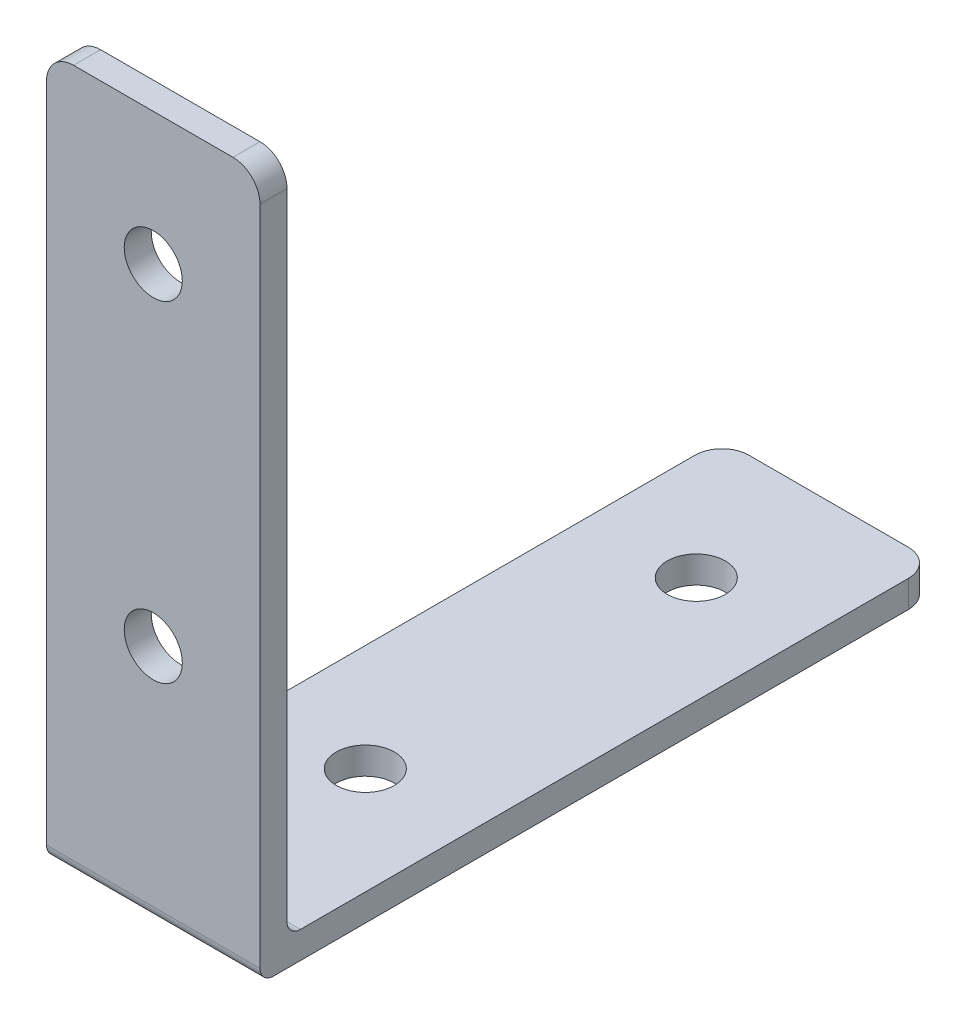
ISO-10303-21;
HEADER;
FILE_DESCRIPTION(('STEP AP214'),'2;1');
FILE_NAME('part.step','',(''),(''),'','','');
FILE_SCHEMA(('AUTOMOTIVE_DESIGN { 1 0 10303 214 1 1 1 1 }'));
ENDSEC;
DATA;
#1=APPLICATION_CONTEXT('core data for automotive mechanical design processes');
#2=APPLICATION_PROTOCOL_DEFINITION('international standard','automotive_design',2000,#1);
#3=PRODUCT_CONTEXT('',#1,'mechanical');
#4=PRODUCT('Part','Part','',(#3));
#5=PRODUCT_RELATED_PRODUCT_CATEGORY('part','',(#4));
#6=PRODUCT_DEFINITION_FORMATION('','',#4);
#7=PRODUCT_DEFINITION_CONTEXT('part definition',#1,'design');
#8=PRODUCT_DEFINITION('design','',#6,#7);
#9=PRODUCT_DEFINITION_SHAPE('','',#8);
#10=(LENGTH_UNIT() NAMED_UNIT(*) SI_UNIT(.MILLI.,.METRE.));
#11=(NAMED_UNIT(*) PLANE_ANGLE_UNIT() SI_UNIT($,.RADIAN.));
#12=(NAMED_UNIT(*) SI_UNIT($,.STERADIAN.) SOLID_ANGLE_UNIT());
#13=UNCERTAINTY_MEASURE_WITH_UNIT(LENGTH_MEASURE(1.E-05),#10,'distance_accuracy_value','');
#14=(GEOMETRIC_REPRESENTATION_CONTEXT(3) GLOBAL_UNCERTAINTY_ASSIGNED_CONTEXT((#13)) GLOBAL_UNIT_ASSIGNED_CONTEXT((#10,
#11,#12)) REPRESENTATION_CONTEXT('',''));
#15=CARTESIAN_POINT('',(0.,0.,0.));
#16=DIRECTION('',(0.,0.,1.));
#17=DIRECTION('',(1.,0.,0.));
#18=AXIS2_PLACEMENT_3D('',#15,#16,#17);
#19=CARTESIAN_POINT('',(0.,0.,49.));
#20=DIRECTION('',(-1.,0.,0.));
#21=DIRECTION('',(0.,-1.,0.));
#22=AXIS2_PLACEMENT_3D('',#19,#20,#21);
#23=CYLINDRICAL_SURFACE('',#22,1.);
#24=DIRECTION('',(1.,0.,0.));
#25=VECTOR('',#24,1.);
#26=CARTESIAN_POINT('',(0.,0.,50.));
#27=LINE('',#26,#25);
#28=CARTESIAN_POINT('',(-7.9,0.,50.));
#29=VERTEX_POINT('',#28);
#30=CARTESIAN_POINT('',(7.9,0.,50.));
#31=VERTEX_POINT('',#30);
#32=EDGE_CURVE('E129',#29,#31,#27,.T.);
#33=ORIENTED_EDGE('',*,*,#32,.F.);
#34=CARTESIAN_POINT('',(-7.9,0.,49.));
#35=DIRECTION('',(1.,0.,0.));
#36=DIRECTION('',(0.,0.,-1.));
#37=AXIS2_PLACEMENT_3D('',#34,#35,#36);
#38=CIRCLE('',#37,1.);
#39=CARTESIAN_POINT('',(-7.9,-1.,49.));
#40=VERTEX_POINT('',#39);
#41=EDGE_CURVE('E136',#40,#29,#38,.F.);
#42=ORIENTED_EDGE('',*,*,#41,.F.);
#43=DIRECTION('',(1.,0.,0.));
#44=VECTOR('',#43,1.);
#45=CARTESIAN_POINT('',(0.,-1.,49.));
#46=LINE('',#45,#44);
#47=CARTESIAN_POINT('',(7.9,-0.999999999999999,49.));
#48=VERTEX_POINT('',#47);
#49=EDGE_CURVE('E146',#48,#40,#46,.F.);
#50=ORIENTED_EDGE('',*,*,#49,.F.);
#51=CARTESIAN_POINT('',(7.9,0.,49.));
#52=DIRECTION('',(-1.,0.,0.));
#53=DIRECTION('',(0.,0.,1.));
#54=AXIS2_PLACEMENT_3D('',#51,#52,#53);
#55=CIRCLE('',#54,1.);
#56=EDGE_CURVE('E145',#31,#48,#55,.F.);
#57=ORIENTED_EDGE('',*,*,#56,.F.);
#58=EDGE_LOOP('',(#33,#42,#50,#57));
#59=FACE_BOUND('',#58,.T.);
#60=ADVANCED_FACE('F32',(#59),#23,.T.);
#61=CARTESIAN_POINT('',(7.9,1.,50.));
#62=DIRECTION('',(0.,-1.,0.));
#63=DIRECTION('',(1.,0.,0.));
#64=AXIS2_PLACEMENT_3D('',#61,#62,#63);
#65=PLANE('',#64);
#66=CARTESIAN_POINT('',(0.,1.,9.8));
#67=DIRECTION('',(0.,1.,0.));
#68=DIRECTION('',(-1.,0.,0.));
#69=AXIS2_PLACEMENT_3D('',#66,#67,#68);
#70=CIRCLE('',#69,2.15);
#71=CARTESIAN_POINT('',(-2.15,1.,9.8));
#72=VERTEX_POINT('',#71);
#73=EDGE_CURVE('E198',#72,#72,#70,.T.);
#74=ORIENTED_EDGE('',*,*,#73,.F.);
#75=EDGE_LOOP('',(#74));
#76=FACE_BOUND('',#75,.T.);
#77=CARTESIAN_POINT('',(0.,1.,34.3));
#78=DIRECTION('',(0.,1.,0.));
#79=DIRECTION('',(-1.,0.,0.));
#80=AXIS2_PLACEMENT_3D('',#77,#78,#79);
#81=CIRCLE('',#80,2.15);
#82=CARTESIAN_POINT('',(-2.15,1.,34.3));
#83=VERTEX_POINT('',#82);
#84=EDGE_CURVE('E204',#83,#83,#81,.T.);
#85=ORIENTED_EDGE('',*,*,#84,.F.);
#86=EDGE_LOOP('',(#85));
#87=FACE_BOUND('',#86,.T.);
#88=DIRECTION('',(0.,0.,-1.));
#89=VECTOR('',#88,1.);
#90=CARTESIAN_POINT('',(7.9,1.,50.));
#91=LINE('',#90,#89);
#92=CARTESIAN_POINT('',(7.9,1.,47.));
#93=VERTEX_POINT('',#92);
#94=CARTESIAN_POINT('',(7.9,1.,2.));
#95=VERTEX_POINT('',#94);
#96=EDGE_CURVE('E238',#93,#95,#91,.T.);
#97=ORIENTED_EDGE('',*,*,#96,.T.);
#98=CARTESIAN_POINT('',(5.9,1.,2.));
#99=DIRECTION('',(0.,-1.,0.));
#100=DIRECTION('',(1.,0.,0.));
#101=AXIS2_PLACEMENT_3D('',#98,#99,#100);
#102=CIRCLE('',#101,2.);
#103=CARTESIAN_POINT('',(5.9,1.,0.));
#104=VERTEX_POINT('',#103);
#105=EDGE_CURVE('E180',#95,#104,#102,.F.);
#106=ORIENTED_EDGE('',*,*,#105,.T.);
#107=DIRECTION('',(-1.,0.,0.));
#108=VECTOR('',#107,1.);
#109=CARTESIAN_POINT('',(7.9,1.,0.));
#110=LINE('',#109,#108);
#111=CARTESIAN_POINT('',(-5.9,1.,0.));
#112=VERTEX_POINT('',#111);
#113=EDGE_CURVE('E133',#104,#112,#110,.T.);
#114=ORIENTED_EDGE('',*,*,#113,.T.);
#115=CARTESIAN_POINT('',(-5.9,1.,2.));
#116=DIRECTION('',(0.,-1.,0.));
#117=DIRECTION('',(1.,0.,0.));
#118=AXIS2_PLACEMENT_3D('',#115,#116,#117);
#119=CIRCLE('',#118,2.);
#120=CARTESIAN_POINT('',(-7.9,1.,2.));
#121=VERTEX_POINT('',#120);
#122=EDGE_CURVE('E178',#112,#121,#119,.F.);
#123=ORIENTED_EDGE('',*,*,#122,.T.);
#124=DIRECTION('',(0.,0.,-1.));
#125=VECTOR('',#124,1.);
#126=CARTESIAN_POINT('',(-7.9,1.,50.));
#127=LINE('',#126,#125);
#128=CARTESIAN_POINT('',(-7.9,1.,47.));
#129=VERTEX_POINT('',#128);
#130=EDGE_CURVE('E232',#129,#121,#127,.T.);
#131=ORIENTED_EDGE('',*,*,#130,.F.);
#132=DIRECTION('',(-1.,0.,0.));
#133=VECTOR('',#132,1.);
#134=CARTESIAN_POINT('',(7.9,1.,47.));
#135=LINE('',#134,#133);
#136=EDGE_CURVE('E158',#129,#93,#135,.F.);
#137=ORIENTED_EDGE('',*,*,#136,.T.);
#138=EDGE_LOOP('',(#97,#106,#114,#123,#131,#137));
#139=FACE_BOUND('',#138,.T.);
#140=ADVANCED_FACE('F253',(#76,#87,#139),#65,.F.);
#141=CARTESIAN_POINT('',(-7.9,-1.,50.));
#142=DIRECTION('',(1.,0.,0.));
#143=DIRECTION('',(0.,0.,-1.));
#144=AXIS2_PLACEMENT_3D('',#141,#142,#143);
#145=PLANE('',#144);
#146=ORIENTED_EDGE('',*,*,#130,.T.);
#147=DIRECTION('',(0.,-1.,0.));
#148=VECTOR('',#147,1.);
#149=CARTESIAN_POINT('',(-7.9,-1.,2.));
#150=LINE('',#149,#148);
#151=CARTESIAN_POINT('',(-7.9,-1.,2.));
#152=VERTEX_POINT('',#151);
#153=EDGE_CURVE('E192',#121,#152,#150,.T.);
#154=ORIENTED_EDGE('',*,*,#153,.T.);
#155=DIRECTION('',(0.,0.,-1.));
#156=VECTOR('',#155,1.);
#157=CARTESIAN_POINT('',(-7.9,-1.,50.));
#158=LINE('',#157,#156);
#159=EDGE_CURVE('E141',#40,#152,#158,.T.);
#160=ORIENTED_EDGE('',*,*,#159,.F.);
#161=ORIENTED_EDGE('',*,*,#41,.T.);
#162=DIRECTION('',(0.,-1.,0.));
#163=VECTOR('',#162,1.);
#164=CARTESIAN_POINT('',(-7.9,-1.,50.));
#165=LINE('',#164,#163);
#166=CARTESIAN_POINT('',(-7.9,49.,50.));
#167=VERTEX_POINT('',#166);
#168=EDGE_CURVE('E123',#167,#29,#165,.T.);
#169=ORIENTED_EDGE('',*,*,#168,.F.);
#170=DIRECTION('',(0.,0.,1.));
#171=VECTOR('',#170,1.);
#172=CARTESIAN_POINT('',(-7.9,49.,50.));
#173=LINE('',#172,#171);
#174=CARTESIAN_POINT('',(-7.90000000000001,49.,48.));
#175=VERTEX_POINT('',#174);
#176=EDGE_CURVE('E190',#167,#175,#173,.F.);
#177=ORIENTED_EDGE('',*,*,#176,.T.);
#178=DIRECTION('',(0.,-1.,0.));
#179=VECTOR('',#178,1.);
#180=CARTESIAN_POINT('',(-7.90000000000001,51.,48.));
#181=LINE('',#180,#179);
#182=CARTESIAN_POINT('',(-7.9,2.,48.));
#183=VERTEX_POINT('',#182);
#184=EDGE_CURVE('E226',#175,#183,#181,.T.);
#185=ORIENTED_EDGE('',*,*,#184,.T.);
#186=CARTESIAN_POINT('',(-7.9,2.,47.));
#187=DIRECTION('',(1.,0.,0.));
#188=DIRECTION('',(0.,0.,-1.));
#189=AXIS2_PLACEMENT_3D('',#186,#187,#188);
#190=CIRCLE('',#189,1.);
#191=EDGE_CURVE('E160',#183,#129,#190,.T.);
#192=ORIENTED_EDGE('',*,*,#191,.T.);
#193=EDGE_LOOP('',(#146,#154,#160,#161,#169,#177,#185,#192));
#194=FACE_BOUND('',#193,.T.);
#195=ADVANCED_FACE('F138',(#194),#145,.F.);
#196=CARTESIAN_POINT('',(7.9,-0.999999999999999,50.));
#197=DIRECTION('',(0.,1.,0.));
#198=DIRECTION('',(-1.,0.,0.));
#199=AXIS2_PLACEMENT_3D('',#196,#197,#198);
#200=PLANE('',#199);
#201=CARTESIAN_POINT('',(0.,-1.,9.8));
#202=DIRECTION('',(0.,1.,0.));
#203=DIRECTION('',(-1.,0.,0.));
#204=AXIS2_PLACEMENT_3D('',#201,#202,#203);
#205=CIRCLE('',#204,2.15);
#206=CARTESIAN_POINT('',(-2.15,-1.,9.8));
#207=VERTEX_POINT('',#206);
#208=EDGE_CURVE('E36',#207,#207,#205,.T.);
#209=ORIENTED_EDGE('',*,*,#208,.T.);
#210=EDGE_LOOP('',(#209));
#211=FACE_BOUND('',#210,.T.);
#212=CARTESIAN_POINT('',(0.,-1.,34.3));
#213=DIRECTION('',(0.,1.,0.));
#214=DIRECTION('',(-1.,0.,0.));
#215=AXIS2_PLACEMENT_3D('',#212,#213,#214);
#216=CIRCLE('',#215,2.15);
#217=CARTESIAN_POINT('',(-2.15,-1.,34.3));
#218=VERTEX_POINT('',#217);
#219=EDGE_CURVE('E196',#218,#218,#216,.T.);
#220=ORIENTED_EDGE('',*,*,#219,.T.);
#221=EDGE_LOOP('',(#220));
#222=FACE_BOUND('',#221,.T.);
#223=DIRECTION('',(1.,0.,0.));
#224=VECTOR('',#223,1.);
#225=CARTESIAN_POINT('',(7.9,-0.999999999999999,0.));
#226=LINE('',#225,#224);
#227=CARTESIAN_POINT('',(-5.9,-1.,0.));
#228=VERTEX_POINT('',#227);
#229=CARTESIAN_POINT('',(5.9,-0.999999999999999,0.));
#230=VERTEX_POINT('',#229);
#231=EDGE_CURVE('E229',#228,#230,#226,.T.);
#232=ORIENTED_EDGE('',*,*,#231,.T.);
#233=CARTESIAN_POINT('',(5.9,-0.999999999999999,2.));
#234=DIRECTION('',(0.,1.,0.));
#235=DIRECTION('',(-1.,0.,0.));
#236=AXIS2_PLACEMENT_3D('',#233,#234,#235);
#237=CIRCLE('',#236,2.);
#238=CARTESIAN_POINT('',(7.9,-0.999999999999999,2.));
#239=VERTEX_POINT('',#238);
#240=EDGE_CURVE('E188',#230,#239,#237,.F.);
#241=ORIENTED_EDGE('',*,*,#240,.T.);
#242=DIRECTION('',(0.,0.,-1.));
#243=VECTOR('',#242,1.);
#244=CARTESIAN_POINT('',(7.9,-0.999999999999999,50.));
#245=LINE('',#244,#243);
#246=EDGE_CURVE('E150',#48,#239,#245,.T.);
#247=ORIENTED_EDGE('',*,*,#246,.F.);
#248=ORIENTED_EDGE('',*,*,#49,.T.);
#249=ORIENTED_EDGE('',*,*,#159,.T.);
#250=CARTESIAN_POINT('',(-5.9,-1.,2.));
#251=DIRECTION('',(0.,1.,0.));
#252=DIRECTION('',(-1.,0.,0.));
#253=AXIS2_PLACEMENT_3D('',#250,#251,#252);
#254=CIRCLE('',#253,2.);
#255=EDGE_CURVE('E186',#152,#228,#254,.F.);
#256=ORIENTED_EDGE('',*,*,#255,.T.);
#257=EDGE_LOOP('',(#232,#241,#247,#248,#249,#256));
#258=FACE_BOUND('',#257,.T.);
#259=ADVANCED_FACE('F371',(#211,#222,#258),#200,.F.);
#260=CARTESIAN_POINT('',(7.9,-0.999999999999999,50.));
#261=DIRECTION('',(-1.,0.,0.));
#262=DIRECTION('',(0.,0.,1.));
#263=AXIS2_PLACEMENT_3D('',#260,#261,#262);
#264=PLANE('',#263);
#265=ORIENTED_EDGE('',*,*,#246,.T.);
#266=DIRECTION('',(0.,1.,0.));
#267=VECTOR('',#266,1.);
#268=CARTESIAN_POINT('',(7.9,-0.999999999999999,2.));
#269=LINE('',#268,#267);
#270=EDGE_CURVE('E175',#239,#95,#269,.T.);
#271=ORIENTED_EDGE('',*,*,#270,.T.);
#272=ORIENTED_EDGE('',*,*,#96,.F.);
#273=CARTESIAN_POINT('',(7.9,2.,47.));
#274=DIRECTION('',(-1.,0.,0.));
#275=DIRECTION('',(0.,0.,1.));
#276=AXIS2_PLACEMENT_3D('',#273,#274,#275);
#277=CIRCLE('',#276,1.);
#278=CARTESIAN_POINT('',(7.9,2.,48.));
#279=VERTEX_POINT('',#278);
#280=EDGE_CURVE('E162',#93,#279,#277,.T.);
#281=ORIENTED_EDGE('',*,*,#280,.T.);
#282=DIRECTION('',(0.,-1.,0.));
#283=VECTOR('',#282,1.);
#284=CARTESIAN_POINT('',(7.89999999999999,51.,48.));
#285=LINE('',#284,#283);
#286=CARTESIAN_POINT('',(7.89999999999999,49.,48.));
#287=VERTEX_POINT('',#286);
#288=EDGE_CURVE('E228',#287,#279,#285,.T.);
#289=ORIENTED_EDGE('',*,*,#288,.F.);
#290=DIRECTION('',(0.,0.,-1.));
#291=VECTOR('',#290,1.);
#292=CARTESIAN_POINT('',(7.9,49.,50.));
#293=LINE('',#292,#291);
#294=CARTESIAN_POINT('',(7.9,49.,50.));
#295=VERTEX_POINT('',#294);
#296=EDGE_CURVE('E170',#287,#295,#293,.F.);
#297=ORIENTED_EDGE('',*,*,#296,.T.);
#298=DIRECTION('',(0.,1.,0.));
#299=VECTOR('',#298,1.);
#300=CARTESIAN_POINT('',(7.9,-0.999999999999999,50.));
#301=LINE('',#300,#299);
#302=EDGE_CURVE('E132',#31,#295,#301,.T.);
#303=ORIENTED_EDGE('',*,*,#302,.F.);
#304=ORIENTED_EDGE('',*,*,#56,.T.);
#305=EDGE_LOOP('',(#265,#271,#272,#281,#289,#297,#303,#304));
#306=FACE_BOUND('',#305,.T.);
#307=ADVANCED_FACE('F244',(#306),#264,.F.);
#308=CARTESIAN_POINT('',(0.,0.,50.));
#309=DIRECTION('',(0.,0.,1.));
#310=DIRECTION('',(1.,0.,0.));
#311=AXIS2_PLACEMENT_3D('',#308,#309,#310);
#312=PLANE('',#311);
#313=CARTESIAN_POINT('',(0.,41.2,50.));
#314=DIRECTION('',(0.,0.,1.));
#315=DIRECTION('',(1.,0.,0.));
#316=AXIS2_PLACEMENT_3D('',#313,#314,#315);
#317=CIRCLE('',#316,2.15);
#318=CARTESIAN_POINT('',(2.15,41.2,50.));
#319=VERTEX_POINT('',#318);
#320=EDGE_CURVE('E219',#319,#319,#317,.T.);
#321=ORIENTED_EDGE('',*,*,#320,.F.);
#322=EDGE_LOOP('',(#321));
#323=FACE_BOUND('',#322,.T.);
#324=CARTESIAN_POINT('',(0.,16.7,50.));
#325=DIRECTION('',(0.,0.,1.));
#326=DIRECTION('',(1.,0.,0.));
#327=AXIS2_PLACEMENT_3D('',#324,#325,#326);
#328=CIRCLE('',#327,2.15);
#329=CARTESIAN_POINT('',(2.15,16.7,50.));
#330=VERTEX_POINT('',#329);
#331=EDGE_CURVE('E214',#330,#330,#328,.T.);
#332=ORIENTED_EDGE('',*,*,#331,.F.);
#333=EDGE_LOOP('',(#332));
#334=FACE_BOUND('',#333,.T.);
#335=DIRECTION('',(1.,0.,0.));
#336=VECTOR('',#335,1.);
#337=CARTESIAN_POINT('',(-7.90000000000001,51.,50.));
#338=LINE('',#337,#336);
#339=CARTESIAN_POINT('',(-5.9,51.,50.));
#340=VERTEX_POINT('',#339);
#341=CARTESIAN_POINT('',(5.9,51.,50.));
#342=VERTEX_POINT('',#341);
#343=EDGE_CURVE('E222',#340,#342,#338,.T.);
#344=ORIENTED_EDGE('',*,*,#343,.F.);
#345=CARTESIAN_POINT('',(-5.9,49.,50.));
#346=DIRECTION('',(0.,0.,1.));
#347=DIRECTION('',(1.,0.,0.));
#348=AXIS2_PLACEMENT_3D('',#345,#346,#347);
#349=CIRCLE('',#348,2.);
#350=EDGE_CURVE('E41',#340,#167,#349,.T.);
#351=ORIENTED_EDGE('',*,*,#350,.T.);
#352=ORIENTED_EDGE('',*,*,#168,.T.);
#353=ORIENTED_EDGE('',*,*,#32,.T.);
#354=ORIENTED_EDGE('',*,*,#302,.T.);
#355=CARTESIAN_POINT('',(5.9,49.,50.));
#356=DIRECTION('',(0.,0.,1.));
#357=DIRECTION('',(1.,0.,0.));
#358=AXIS2_PLACEMENT_3D('',#355,#356,#357);
#359=CIRCLE('',#358,2.);
#360=EDGE_CURVE('E172',#295,#342,#359,.T.);
#361=ORIENTED_EDGE('',*,*,#360,.T.);
#362=EDGE_LOOP('',(#344,#351,#352,#353,#354,#361));
#363=FACE_BOUND('',#362,.T.);
#364=ADVANCED_FACE('F126',(#323,#334,#363),#312,.T.);
#365=CARTESIAN_POINT('',(0.,0.,0.));
#366=DIRECTION('',(0.,0.,1.));
#367=DIRECTION('',(1.,0.,0.));
#368=AXIS2_PLACEMENT_3D('',#365,#366,#367);
#369=PLANE('',#368);
#370=ORIENTED_EDGE('',*,*,#113,.F.);
#371=DIRECTION('',(0.,1.,0.));
#372=VECTOR('',#371,1.);
#373=CARTESIAN_POINT('',(5.9,0.,0.));
#374=LINE('',#373,#372);
#375=EDGE_CURVE('E184',#104,#230,#374,.F.);
#376=ORIENTED_EDGE('',*,*,#375,.T.);
#377=ORIENTED_EDGE('',*,*,#231,.F.);
#378=DIRECTION('',(0.,-1.,0.));
#379=VECTOR('',#378,1.);
#380=CARTESIAN_POINT('',(-5.9,0.,0.));
#381=LINE('',#380,#379);
#382=EDGE_CURVE('E182',#228,#112,#381,.F.);
#383=ORIENTED_EDGE('',*,*,#382,.T.);
#384=EDGE_LOOP('',(#370,#376,#377,#383));
#385=FACE_BOUND('',#384,.T.);
#386=ADVANCED_FACE('F256',(#385),#369,.F.);
#387=CARTESIAN_POINT('',(-7.90000000000001,51.,48.));
#388=DIRECTION('',(0.,0.,1.));
#389=DIRECTION('',(1.,0.,0.));
#390=AXIS2_PLACEMENT_3D('',#387,#388,#389);
#391=PLANE('',#390);
#392=CARTESIAN_POINT('',(0.,41.2,48.));
#393=DIRECTION('',(0.,0.,-1.));
#394=DIRECTION('',(-1.,0.,0.));
#395=AXIS2_PLACEMENT_3D('',#392,#393,#394);
#396=CIRCLE('',#395,2.15);
#397=CARTESIAN_POINT('',(-2.15,41.2,48.));
#398=VERTEX_POINT('',#397);
#399=EDGE_CURVE('E211',#398,#398,#396,.T.);
#400=ORIENTED_EDGE('',*,*,#399,.F.);
#401=EDGE_LOOP('',(#400));
#402=FACE_BOUND('',#401,.T.);
#403=CARTESIAN_POINT('',(0.,16.7,48.));
#404=DIRECTION('',(0.,0.,-1.));
#405=DIRECTION('',(-1.,0.,0.));
#406=AXIS2_PLACEMENT_3D('',#403,#404,#405);
#407=CIRCLE('',#406,2.15);
#408=CARTESIAN_POINT('',(-2.15,16.7,48.));
#409=VERTEX_POINT('',#408);
#410=EDGE_CURVE('E202',#409,#409,#407,.T.);
#411=ORIENTED_EDGE('',*,*,#410,.F.);
#412=EDGE_LOOP('',(#411));
#413=FACE_BOUND('',#412,.T.);
#414=ORIENTED_EDGE('',*,*,#184,.F.);
#415=CARTESIAN_POINT('',(-5.9,49.,48.));
#416=DIRECTION('',(0.,0.,1.));
#417=DIRECTION('',(1.,0.,0.));
#418=AXIS2_PLACEMENT_3D('',#415,#416,#417);
#419=CIRCLE('',#418,2.);
#420=CARTESIAN_POINT('',(-5.9,51.,48.));
#421=VERTEX_POINT('',#420);
#422=EDGE_CURVE('E11',#175,#421,#419,.F.);
#423=ORIENTED_EDGE('',*,*,#422,.T.);
#424=DIRECTION('',(-1.,0.,0.));
#425=VECTOR('',#424,1.);
#426=CARTESIAN_POINT('',(-7.90000000000001,51.,48.));
#427=LINE('',#426,#425);
#428=CARTESIAN_POINT('',(5.9,51.,48.));
#429=VERTEX_POINT('',#428);
#430=EDGE_CURVE('E224',#429,#421,#427,.T.);
#431=ORIENTED_EDGE('',*,*,#430,.F.);
#432=CARTESIAN_POINT('',(5.9,49.,48.));
#433=DIRECTION('',(0.,0.,1.));
#434=DIRECTION('',(1.,0.,0.));
#435=AXIS2_PLACEMENT_3D('',#432,#433,#434);
#436=CIRCLE('',#435,2.);
#437=EDGE_CURVE('E168',#429,#287,#436,.F.);
#438=ORIENTED_EDGE('',*,*,#437,.T.);
#439=ORIENTED_EDGE('',*,*,#288,.T.);
#440=DIRECTION('',(-1.,0.,0.));
#441=VECTOR('',#440,1.);
#442=CARTESIAN_POINT('',(-7.9,2.,48.));
#443=LINE('',#442,#441);
#444=EDGE_CURVE('E155',#279,#183,#443,.T.);
#445=ORIENTED_EDGE('',*,*,#444,.T.);
#446=EDGE_LOOP('',(#414,#423,#431,#438,#439,#445));
#447=FACE_BOUND('',#446,.T.);
#448=ADVANCED_FACE('F269',(#402,#413,#447),#391,.F.);
#449=CARTESIAN_POINT('',(0.,51.,0.));
#450=DIRECTION('',(0.,-1.,0.));
#451=DIRECTION('',(1.,0.,0.));
#452=AXIS2_PLACEMENT_3D('',#449,#450,#451);
#453=PLANE('',#452);
#454=ORIENTED_EDGE('',*,*,#430,.T.);
#455=DIRECTION('',(0.,0.,1.));
#456=VECTOR('',#455,1.);
#457=CARTESIAN_POINT('',(-5.9,51.,0.));
#458=LINE('',#457,#456);
#459=EDGE_CURVE('E194',#421,#340,#458,.T.);
#460=ORIENTED_EDGE('',*,*,#459,.T.);
#461=ORIENTED_EDGE('',*,*,#343,.T.);
#462=DIRECTION('',(0.,0.,-1.));
#463=VECTOR('',#462,1.);
#464=CARTESIAN_POINT('',(5.9,51.,0.));
#465=LINE('',#464,#463);
#466=EDGE_CURVE('E165',#342,#429,#465,.T.);
#467=ORIENTED_EDGE('',*,*,#466,.T.);
#468=EDGE_LOOP('',(#454,#460,#461,#467));
#469=FACE_BOUND('',#468,.T.);
#470=ADVANCED_FACE('F277',(#469),#453,.F.);
#471=CARTESIAN_POINT('',(-7.9,2.,47.));
#472=DIRECTION('',(1.,0.,0.));
#473=DIRECTION('',(0.,1.,0.));
#474=AXIS2_PLACEMENT_3D('',#471,#472,#473);
#475=CYLINDRICAL_SURFACE('',#474,1.);
#476=ORIENTED_EDGE('',*,*,#280,.F.);
#477=ORIENTED_EDGE('',*,*,#136,.F.);
#478=ORIENTED_EDGE('',*,*,#191,.F.);
#479=ORIENTED_EDGE('',*,*,#444,.F.);
#480=EDGE_LOOP('',(#476,#477,#478,#479));
#481=FACE_BOUND('',#480,.T.);
#482=ADVANCED_FACE('F268',(#481),#475,.F.);
#483=CARTESIAN_POINT('',(5.9,49.,0.));
#484=DIRECTION('',(0.,0.,-1.));
#485=DIRECTION('',(-1.,0.,0.));
#486=AXIS2_PLACEMENT_3D('',#483,#484,#485);
#487=CYLINDRICAL_SURFACE('',#486,2.);
#488=ORIENTED_EDGE('',*,*,#360,.F.);
#489=ORIENTED_EDGE('',*,*,#296,.F.);
#490=ORIENTED_EDGE('',*,*,#437,.F.);
#491=ORIENTED_EDGE('',*,*,#466,.F.);
#492=EDGE_LOOP('',(#488,#489,#490,#491));
#493=FACE_BOUND('',#492,.T.);
#494=ADVANCED_FACE('F274',(#493),#487,.T.);
#495=CARTESIAN_POINT('',(5.9,-0.999999999999999,2.));
#496=DIRECTION('',(0.,1.,0.));
#497=DIRECTION('',(0.,0.,1.));
#498=AXIS2_PLACEMENT_3D('',#495,#496,#497);
#499=CYLINDRICAL_SURFACE('',#498,2.);
#500=ORIENTED_EDGE('',*,*,#240,.F.);
#501=ORIENTED_EDGE('',*,*,#375,.F.);
#502=ORIENTED_EDGE('',*,*,#105,.F.);
#503=ORIENTED_EDGE('',*,*,#270,.F.);
#504=EDGE_LOOP('',(#500,#501,#502,#503));
#505=FACE_BOUND('',#504,.T.);
#506=ADVANCED_FACE('F249',(#505),#499,.T.);
#507=CARTESIAN_POINT('',(-5.9,-1.,2.));
#508=DIRECTION('',(0.,-1.,0.));
#509=DIRECTION('',(0.,0.,-1.));
#510=AXIS2_PLACEMENT_3D('',#507,#508,#509);
#511=CYLINDRICAL_SURFACE('',#510,2.);
#512=ORIENTED_EDGE('',*,*,#122,.F.);
#513=ORIENTED_EDGE('',*,*,#382,.F.);
#514=ORIENTED_EDGE('',*,*,#255,.F.);
#515=ORIENTED_EDGE('',*,*,#153,.F.);
#516=EDGE_LOOP('',(#512,#513,#514,#515));
#517=FACE_BOUND('',#516,.T.);
#518=ADVANCED_FACE('F260',(#517),#511,.T.);
#519=CARTESIAN_POINT('',(-5.9,49.,0.));
#520=DIRECTION('',(0.,0.,1.));
#521=DIRECTION('',(1.,0.,0.));
#522=AXIS2_PLACEMENT_3D('',#519,#520,#521);
#523=CYLINDRICAL_SURFACE('',#522,2.);
#524=ORIENTED_EDGE('',*,*,#422,.F.);
#525=ORIENTED_EDGE('',*,*,#176,.F.);
#526=ORIENTED_EDGE('',*,*,#350,.F.);
#527=ORIENTED_EDGE('',*,*,#459,.F.);
#528=EDGE_LOOP('',(#524,#525,#526,#527));
#529=FACE_BOUND('',#528,.T.);
#530=ADVANCED_FACE('F34',(#529),#523,.T.);
#531=CARTESIAN_POINT('',(0.,16.7,98.));
#532=DIRECTION('',(0.,0.,-1.));
#533=DIRECTION('',(-1.,0.,0.));
#534=AXIS2_PLACEMENT_3D('',#531,#532,#533);
#535=CYLINDRICAL_SURFACE('',#534,2.15);
#536=ORIENTED_EDGE('',*,*,#331,.T.);
#537=EDGE_LOOP('',(#536));
#538=FACE_BOUND('',#537,.T.);
#539=ORIENTED_EDGE('',*,*,#410,.T.);
#540=EDGE_LOOP('',(#539));
#541=FACE_BOUND('',#540,.T.);
#542=ADVANCED_FACE('F279',(#538,#541),#535,.F.);
#543=CARTESIAN_POINT('',(0.,41.2,98.));
#544=DIRECTION('',(0.,0.,-1.));
#545=DIRECTION('',(-1.,0.,0.));
#546=AXIS2_PLACEMENT_3D('',#543,#544,#545);
#547=CYLINDRICAL_SURFACE('',#546,2.15);
#548=ORIENTED_EDGE('',*,*,#320,.T.);
#549=EDGE_LOOP('',(#548));
#550=FACE_BOUND('',#549,.T.);
#551=ORIENTED_EDGE('',*,*,#399,.T.);
#552=EDGE_LOOP('',(#551));
#553=FACE_BOUND('',#552,.T.);
#554=ADVANCED_FACE('F284',(#550,#553),#547,.F.);
#555=CARTESIAN_POINT('',(0.,-49.,34.3));
#556=DIRECTION('',(0.,1.,0.));
#557=DIRECTION('',(-1.,0.,0.));
#558=AXIS2_PLACEMENT_3D('',#555,#556,#557);
#559=CYLINDRICAL_SURFACE('',#558,2.15);
#560=ORIENTED_EDGE('',*,*,#84,.T.);
#561=EDGE_LOOP('',(#560));
#562=FACE_BOUND('',#561,.T.);
#563=ORIENTED_EDGE('',*,*,#219,.F.);
#564=EDGE_LOOP('',(#563));
#565=FACE_BOUND('',#564,.T.);
#566=ADVANCED_FACE('F354',(#562,#565),#559,.F.);
#567=CARTESIAN_POINT('',(0.,-49.,9.8));
#568=DIRECTION('',(0.,1.,0.));
#569=DIRECTION('',(-1.,0.,0.));
#570=AXIS2_PLACEMENT_3D('',#567,#568,#569);
#571=CYLINDRICAL_SURFACE('',#570,2.15);
#572=ORIENTED_EDGE('',*,*,#73,.T.);
#573=EDGE_LOOP('',(#572));
#574=FACE_BOUND('',#573,.T.);
#575=ORIENTED_EDGE('',*,*,#208,.F.);
#576=EDGE_LOOP('',(#575));
#577=FACE_BOUND('',#576,.T.);
#578=ADVANCED_FACE('F384',(#574,#577),#571,.F.);
#579=CLOSED_SHELL('',(#60,#140,#195,#259,#307,#364,#386,#448,#470,#482,#494,#506,#518,#530,#542,
#554,#566,#578));
#580=MANIFOLD_SOLID_BREP('B2',#579);
#581=ADVANCED_BREP_SHAPE_REPRESENTATION('',(#18,#580),#14);
#582=SHAPE_DEFINITION_REPRESENTATION(#9,#581);
ENDSEC;
END-ISO-10303-21;
